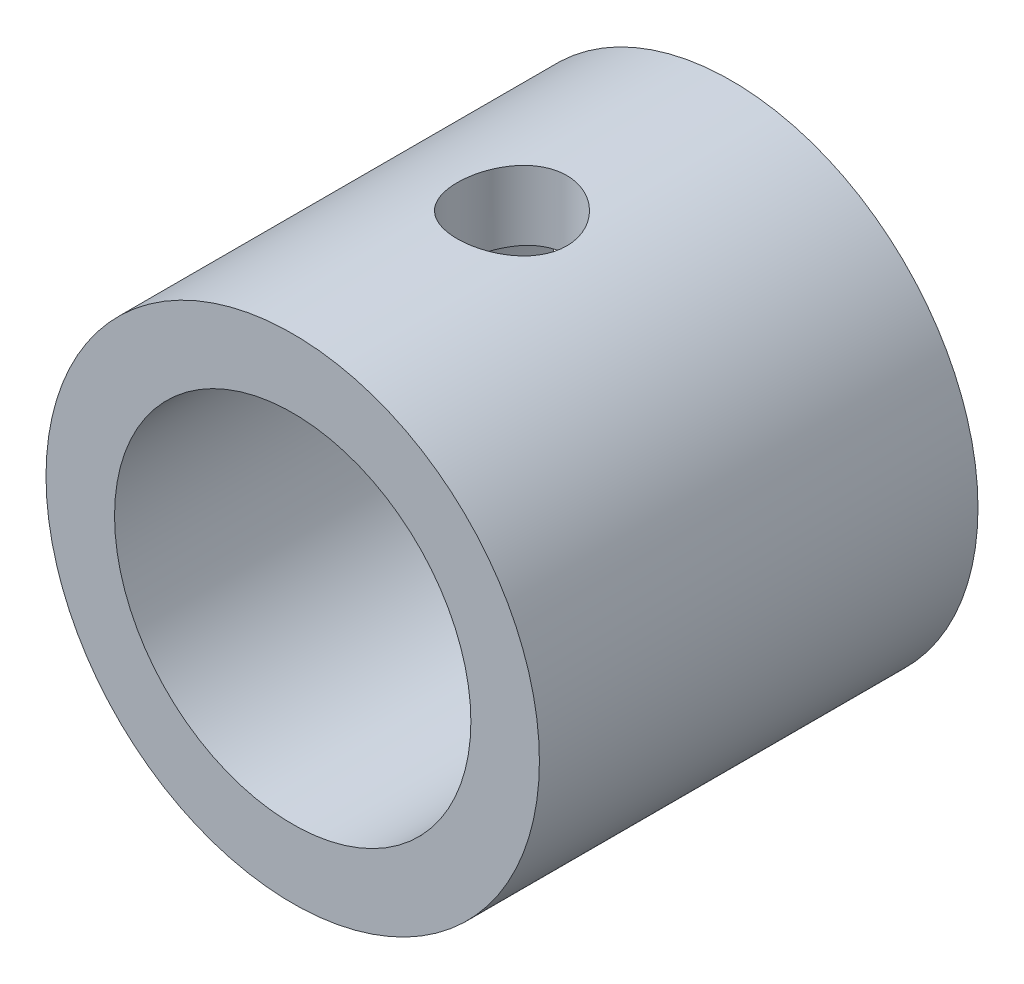
ISO-10303-21;
HEADER;
FILE_DESCRIPTION(('STEP AP214'),'2;1');
FILE_NAME('part.step','',(''),(''),'','','');
FILE_SCHEMA(('AUTOMOTIVE_DESIGN { 1 0 10303 214 1 1 1 1 }'));
ENDSEC;
DATA;
#1=APPLICATION_CONTEXT('core data for automotive mechanical design processes');
#2=APPLICATION_PROTOCOL_DEFINITION('international standard','automotive_design',2000,#1);
#3=PRODUCT_CONTEXT('',#1,'mechanical');
#4=PRODUCT('Part','Part','',(#3));
#5=PRODUCT_RELATED_PRODUCT_CATEGORY('part','',(#4));
#6=PRODUCT_DEFINITION_FORMATION('','',#4);
#7=PRODUCT_DEFINITION_CONTEXT('part definition',#1,'design');
#8=PRODUCT_DEFINITION('design','',#6,#7);
#9=PRODUCT_DEFINITION_SHAPE('','',#8);
#10=(LENGTH_UNIT() NAMED_UNIT(*) SI_UNIT(.MILLI.,.METRE.));
#11=(NAMED_UNIT(*) PLANE_ANGLE_UNIT() SI_UNIT($,.RADIAN.));
#12=(NAMED_UNIT(*) SI_UNIT($,.STERADIAN.) SOLID_ANGLE_UNIT());
#13=UNCERTAINTY_MEASURE_WITH_UNIT(LENGTH_MEASURE(1.E-05),#10,'distance_accuracy_value','');
#14=(GEOMETRIC_REPRESENTATION_CONTEXT(3) GLOBAL_UNCERTAINTY_ASSIGNED_CONTEXT((#13)) GLOBAL_UNIT_ASSIGNED_CONTEXT((#10,
#11,#12)) REPRESENTATION_CONTEXT('',''));
#15=CARTESIAN_POINT('',(0.,0.,0.));
#16=DIRECTION('',(0.,0.,1.));
#17=DIRECTION('',(1.,0.,0.));
#18=AXIS2_PLACEMENT_3D('',#15,#16,#17);
#19=CARTESIAN_POINT('',(0.,0.,8.));
#20=DIRECTION('',(0.,0.,-1.));
#21=DIRECTION('',(-1.,0.,0.));
#22=AXIS2_PLACEMENT_3D('',#19,#20,#21);
#23=CYLINDRICAL_SURFACE('',#22,9.);
#24=CARTESIAN_POINT('',(0.,0.,8.));
#25=DIRECTION('',(0.,0.,1.));
#26=DIRECTION('',(1.,0.,0.));
#27=AXIS2_PLACEMENT_3D('',#24,#25,#26);
#28=CIRCLE('',#27,9.);
#29=CARTESIAN_POINT('',(9.,0.,8.));
#30=VERTEX_POINT('',#29);
#31=EDGE_CURVE('E10',#30,#30,#28,.T.);
#32=ORIENTED_EDGE('',*,*,#31,.F.);
#33=EDGE_LOOP('',(#32));
#34=FACE_BOUND('',#33,.T.);
#35=CARTESIAN_POINT('',(0.,0.,-8.));
#36=DIRECTION('',(0.,0.,1.));
#37=DIRECTION('',(1.,0.,0.));
#38=AXIS2_PLACEMENT_3D('',#35,#36,#37);
#39=CIRCLE('',#38,9.);
#40=CARTESIAN_POINT('',(9.,0.,-8.));
#41=VERTEX_POINT('',#40);
#42=EDGE_CURVE('E38',#41,#41,#39,.T.);
#43=ORIENTED_EDGE('',*,*,#42,.T.);
#44=EDGE_LOOP('',(#43));
#45=FACE_BOUND('',#44,.T.);
#46=CARTESIAN_POINT('',(0.,9.,-2.));
#47=CARTESIAN_POINT('',(0.110880476775648,8.99999796218252,-1.99999627632018));
#48=CARTESIAN_POINT('',(0.22180556526962,8.99793013995692,-1.99074801833651));
#49=CARTESIAN_POINT('',(0.440501944103134,8.9898809775767,-1.95403952764944));
#50=CARTESIAN_POINT('',(0.548270975138988,8.98389690217348,-1.92656656599072));
#51=CARTESIAN_POINT('',(0.757463277761529,8.96868113169008,-1.85431402950835));
#52=CARTESIAN_POINT('',(0.858893152100285,8.95945288439083,-1.80955282300213));
#53=CARTESIAN_POINT('',(1.05280018031376,8.93874335441378,-1.70405338752759));
#54=CARTESIAN_POINT('',(1.14527750793335,8.92726211547358,-1.64331546870938));
#55=CARTESIAN_POINT('',(1.32018631401403,8.9030909417421,-1.50652433489332));
#56=CARTESIAN_POINT('',(1.40244861204353,8.89038561641427,-1.43025749786486));
#57=CARTESIAN_POINT('',(1.55312491045837,8.86530601079787,-1.26503193990686));
#58=CARTESIAN_POINT('',(1.62153764410855,8.85293176088049,-1.17607205928954));
#59=CARTESIAN_POINT('',(1.7433244341035,8.82976328261711,-0.9867281559417));
#60=CARTESIAN_POINT('',(1.79651742104404,8.81898875742981,-0.886225041958469));
#61=CARTESIAN_POINT('',(1.88519298954508,8.80046096352395,-0.677427238307578));
#62=CARTESIAN_POINT('',(1.92067776220096,8.79270732104771,-0.569133514495745));
#63=CARTESIAN_POINT('',(1.97236858006404,8.78125609459189,-0.349666522677334));
#64=CARTESIAN_POINT('',(1.98887467038069,8.77749545807783,-0.238567284894573));
#65=CARTESIAN_POINT('',(2.00307270997673,8.77426673730669,-0.0151177822137992));
#66=CARTESIAN_POINT('',(2.00076704911663,8.77479810778939,0.0972323219621479));
#67=CARTESIAN_POINT('',(1.97764827517302,8.78003632148146,0.317756627193803));
#68=CARTESIAN_POINT('',(1.95718464460217,8.78466431384841,0.425969624139346));
#69=CARTESIAN_POINT('',(1.89888490681146,8.79744954191676,0.637387143325004));
#70=CARTESIAN_POINT('',(1.86104779681652,8.80560698133176,0.740591376085401));
#71=CARTESIAN_POINT('',(1.76875672872875,8.82460909970296,0.940039438381882));
#72=CARTESIAN_POINT('',(1.71416919379353,8.8354752436249,1.03621932733607));
#73=CARTESIAN_POINT('',(1.5900206813985,8.85865737910744,1.21818287051589));
#74=CARTESIAN_POINT('',(1.52045760074274,8.87097357420597,1.30396506182015));
#75=CARTESIAN_POINT('',(1.36648683702983,8.89600574612666,1.46470930934847));
#76=CARTESIAN_POINT('',(1.28178220526623,8.90872450687872,1.53938678510506));
#77=CARTESIAN_POINT('',(1.10090661809162,8.93287839122317,1.67352372890712));
#78=CARTESIAN_POINT('',(1.00473544183737,8.94431349008427,1.7329829037819));
#79=CARTESIAN_POINT('',(0.803303190734734,8.96465064233607,1.83506927577681));
#80=CARTESIAN_POINT('',(0.698022122319853,8.97354693007659,1.87765824430826));
#81=CARTESIAN_POINT('',(0.481555930981455,8.98776136366255,1.94446101305787));
#82=CARTESIAN_POINT('',(0.370371697593365,8.99308004696785,1.96867757341413));
#83=CARTESIAN_POINT('',(0.147695483280844,8.99946317761673,1.99763201325517));
#84=CARTESIAN_POINT('',(0.0362563973189042,9.0006124862229,2.00275850016168));
#85=CARTESIAN_POINT('',(-0.185885923928081,8.99876558650597,1.99444189573963));
#86=CARTESIAN_POINT('',(-0.296589210270647,8.9957696689046,1.98100010668055));
#87=CARTESIAN_POINT('',(-0.512823257329422,8.98602258758613,1.9362505848319));
#88=CARTESIAN_POINT('',(-0.618398491715484,8.97931447007761,1.90514754377655));
#89=CARTESIAN_POINT('',(-0.822832805855832,8.96289421086795,1.82618631255492));
#90=CARTESIAN_POINT('',(-0.921691300010178,8.95318180764659,1.77832666369399));
#91=CARTESIAN_POINT('',(-1.11148643989438,8.9316215322764,1.66640712320101));
#92=CARTESIAN_POINT('',(-1.20228573083225,8.91974444590247,1.60212005699384));
#93=CARTESIAN_POINT('',(-1.37194696498812,8.8952303234908,1.45946875089856));
#94=CARTESIAN_POINT('',(-1.45080730173413,8.88259318550175,1.3811026196679));
#95=CARTESIAN_POINT('',(-1.59589548190985,8.8576887894581,1.2107319664193));
#96=CARTESIAN_POINT('',(-1.66185381940073,8.84543317664284,1.1184959099934));
#97=CARTESIAN_POINT('',(-1.77734611922752,8.82295395378308,0.924027965589185));
#98=CARTESIAN_POINT('',(-1.82688079926974,8.8127302549527,0.821796514657903));
#99=CARTESIAN_POINT('',(-1.90778001896259,8.79557200548926,0.610791710894863));
#100=CARTESIAN_POINT('',(-1.93924786354759,8.78861879659787,0.502059557731161));
#101=CARTESIAN_POINT('',(-1.98342027658406,8.77875649697392,0.280675815137526));
#102=CARTESIAN_POINT('',(-1.99612795718356,8.77584673547331,0.168024878974045));
#103=CARTESIAN_POINT('',(-2.00228356641044,8.77444401448977,-0.055278878278329));
#104=CARTESIAN_POINT('',(-1.99615913143933,8.77585298370124,-0.165919508060061));
#105=CARTESIAN_POINT('',(-1.96578277121688,8.78270664957547,-0.38454970996682));
#106=CARTESIAN_POINT('',(-1.94153107400239,8.78815129547033,-0.492539315423485));
#107=CARTESIAN_POINT('',(-1.87579819980744,8.80241428131525,-0.70244912022738));
#108=CARTESIAN_POINT('',(-1.83438116628454,8.8112200518277,-0.804390316881597));
#109=CARTESIAN_POINT('',(-1.73554770348342,8.83121764469058,-0.999939992546728));
#110=CARTESIAN_POINT('',(-1.67812954585193,8.84240972476633,-1.09354756996401));
#111=CARTESIAN_POINT('',(-1.54751358990558,8.8662104283533,-1.27187660894797));
#112=CARTESIAN_POINT('',(-1.47401185511038,8.8788437136774,-1.35637220492265));
#113=CARTESIAN_POINT('',(-1.31392870594504,8.90393974173387,-1.51197007393133));
#114=CARTESIAN_POINT('',(-1.22734426623343,8.91640244429053,-1.58306924050841));
#115=CARTESIAN_POINT('',(-1.04214597064557,8.93995259726581,-1.71077598291992));
#116=CARTESIAN_POINT('',(-0.943385636634949,8.95101923499229,-1.76717519973493));
#117=CARTESIAN_POINT('',(-0.737560279778818,8.97032058369249,-1.86248330418121));
#118=CARTESIAN_POINT('',(-0.630502203312995,8.97855763270815,-1.90140664004617));
#119=CARTESIAN_POINT('',(-0.436138247729409,8.98982812909554,-1.95384135027679));
#120=CARTESIAN_POINT('',(-0.349871991901682,8.9936186902321,-1.97111737366629));
#121=CARTESIAN_POINT('',(-0.175746449894528,8.99870537459789,-1.99419790430615));
#122=CARTESIAN_POINT('',(-0.0878872388928781,9.00000161523613,-2.0000029515019));
#123=CARTESIAN_POINT('',(0.,9.,-2.));
#124=B_SPLINE_CURVE_WITH_KNOTS('',3,(#46,#47,#48,#49,#50,#51,#52,#53,#54,#55,#56,#57,#58,#59,
#60,#61,#62,#63,#64,#65,#66,#67,#68,#69,#70,#71,#72,#73,#74,#75,#76,#77,#78,#79,#80,#81,#82,#83,
#84,#85,#86,#87,#88,#89,#90,#91,#92,#93,#94,#95,#96,#97,#98,#99,#100,#101,#102,#103,#104,#105,
#106,#107,#108,#109,#110,#111,#112,#113,#114,#115,#116,#117,#118,#119,#120,#121,#122,#123),
.UNSPECIFIED.,.T.,.F.,(4,2,2,2,2,2,2,2,2,2,2,2,2,2,2,2,2,2,2,2,2,2,2,2,2,2,2,2,2,2,2,2,2,2,2,2,
2,2,4),(0.,0.332319689729797,0.664871731249283,0.997071412407459,1.32926464516989,
1.66638072002079,2.00352761490514,2.34453296297976,2.6854961068774,3.02099125638107,
3.35644378496591,3.68557668145784,4.0147285774694,4.34657669709581,4.678471452583,
5.01778179808977,5.35709867969828,5.69718012811238,6.03721047501988,6.37027992124269,
6.70332600912267,7.03258869425167,7.36188004945459,7.69599803262041,8.03016093387756,
8.37069473105728,8.71121364510411,9.04976559055243,9.38826136686411,9.71912785142416,
10.0499901738286,10.3796271201578,10.7092996858639,11.0458432631282,11.3824647846641,
11.7236258704957,12.0645043787094,12.3279234735856,12.5913301688795),.UNSPECIFIED.);
#125=CARTESIAN_POINT('',(0.,9.,-2.));
#126=VERTEX_POINT('',#125);
#127=EDGE_CURVE('E53',#126,#126,#124,.T.);
#128=ORIENTED_EDGE('',*,*,#127,.T.);
#129=EDGE_LOOP('',(#128));
#130=FACE_BOUND('',#129,.T.);
#131=ADVANCED_FACE('F35',(#34,#45,#130),#23,.T.);
#132=CARTESIAN_POINT('',(0.,0.,8.));
#133=DIRECTION('',(0.,0.,-1.));
#134=DIRECTION('',(-1.,0.,0.));
#135=AXIS2_PLACEMENT_3D('',#132,#133,#134);
#136=CYLINDRICAL_SURFACE('',#135,6.5);
#137=CARTESIAN_POINT('',(0.,0.,-8.));
#138=DIRECTION('',(0.,0.,1.));
#139=DIRECTION('',(1.,0.,0.));
#140=AXIS2_PLACEMENT_3D('',#137,#138,#139);
#141=CIRCLE('',#140,6.5);
#142=CARTESIAN_POINT('',(6.5,0.,-8.));
#143=VERTEX_POINT('',#142);
#144=EDGE_CURVE('E47',#143,#143,#141,.T.);
#145=ORIENTED_EDGE('',*,*,#144,.F.);
#146=EDGE_LOOP('',(#145));
#147=FACE_BOUND('',#146,.T.);
#148=CARTESIAN_POINT('',(0.,0.,8.));
#149=DIRECTION('',(0.,0.,1.));
#150=DIRECTION('',(1.,0.,0.));
#151=AXIS2_PLACEMENT_3D('',#148,#149,#150);
#152=CIRCLE('',#151,6.5);
#153=CARTESIAN_POINT('',(6.5,0.,8.));
#154=VERTEX_POINT('',#153);
#155=EDGE_CURVE('E45',#154,#154,#152,.T.);
#156=ORIENTED_EDGE('',*,*,#155,.T.);
#157=EDGE_LOOP('',(#156));
#158=FACE_BOUND('',#157,.T.);
#159=CARTESIAN_POINT('',(0.,6.5,-2.));
#160=CARTESIAN_POINT('',(0.10958647155408,6.49999929187436,-1.99999903907904));
#161=CARTESIAN_POINT('',(0.219182761349475,6.49720235792931,-1.99096335239673));
#162=CARTESIAN_POINT('',(0.435175528984373,6.48631855265072,-1.95515058806477));
#163=CARTESIAN_POINT('',(0.541571186300281,6.47823033671536,-1.92836900086749));
#164=CARTESIAN_POINT('',(0.748016546984701,6.45764858487676,-1.85804929310721));
#165=CARTESIAN_POINT('',(0.848075627090343,6.44516174661238,-1.81453663922322));
#166=CARTESIAN_POINT('',(1.03947745536717,6.41707535917941,-1.71209679263276));
#167=CARTESIAN_POINT('',(1.13081890919355,6.40147534884382,-1.65316731576617));
#168=CARTESIAN_POINT('',(1.30493699247679,6.36829752406617,-1.51970232456005));
#169=CARTESIAN_POINT('',(1.38741488565838,6.35067760587489,-1.44478758075688));
#170=CARTESIAN_POINT('',(1.53885708269872,6.31569252815343,-1.28228637649204));
#171=CARTESIAN_POINT('',(1.60781896662595,6.29832741475793,-1.19469765172807));
#172=CARTESIAN_POINT('',(1.73187276184925,6.2653687784566,-1.00677139557264));
#173=CARTESIAN_POINT('',(1.78659481361997,6.24982736044083,-0.906179710702226));
#174=CARTESIAN_POINT('',(1.8782224418158,6.22290748386974,-0.696666036262746));
#175=CARTESIAN_POINT('',(1.91513254914664,6.21152796681115,-0.58774617334561));
#176=CARTESIAN_POINT('',(1.96900160513188,6.19466009001292,-0.36803269394755));
#177=CARTESIAN_POINT('',(1.9865133955599,6.18900890037713,-0.257387466392708));
#178=CARTESIAN_POINT('',(2.00281555895419,6.1837537050085,-0.0345962594275914));
#179=CARTESIAN_POINT('',(2.00161073572821,6.18414814760279,0.077549327517495));
#180=CARTESIAN_POINT('',(1.98094698228321,6.19079569362891,0.2956150705989));
#181=CARTESIAN_POINT('',(1.96218684702854,6.19682450731138,0.401609425322224));
#182=CARTESIAN_POINT('',(1.90807645250928,6.21369772255051,0.608866696596906));
#183=CARTESIAN_POINT('',(1.87272447914839,6.22454262164885,0.710129123105842));
#184=CARTESIAN_POINT('',(1.785932217008,6.25000070721951,0.906730047845012));
#185=CARTESIAN_POINT('',(1.73426970827151,6.2646654217354,1.00196348562844));
#186=CARTESIAN_POINT('',(1.61647725848254,6.29608673576222,1.18264054437169));
#187=CARTESIAN_POINT('',(1.55034365635742,6.31284386417593,1.26808167960593));
#188=CARTESIAN_POINT('',(1.40204114131455,6.34746551983527,1.43070438833206));
#189=CARTESIAN_POINT('',(1.31929416295853,6.36534631113152,1.50735628256663));
#190=CARTESIAN_POINT('',(1.14189770882472,6.39954830533242,1.64582220434313));
#191=CARTESIAN_POINT('',(1.04724740490765,6.4158693995865,1.7076351986405));
#192=CARTESIAN_POINT('',(0.847732923697558,6.44527556867774,1.8150129771275));
#193=CARTESIAN_POINT('',(0.742798718966909,6.45833594999018,1.86045486403883));
#194=CARTESIAN_POINT('',(0.526280934909782,6.47957102319473,1.93288625395853));
#195=CARTESIAN_POINT('',(0.414699321015766,6.48774715140185,1.95988118201066));
#196=CARTESIAN_POINT('',(0.192552832432243,6.49806290071844,1.99375804657509));
#197=CARTESIAN_POINT('',(0.0821071867281238,6.50041772114305,2.0013573525657));
#198=CARTESIAN_POINT('',(-0.138491178007733,6.49946000316609,1.99824523351199));
#199=CARTESIAN_POINT('',(-0.248643936188298,6.49614826472318,1.98753639306293));
#200=CARTESIAN_POINT('',(-0.46278580145148,6.48437074848215,1.94868951788977));
#201=CARTESIAN_POINT('',(-0.566859358780056,6.47603039774079,1.92097535283384));
#202=CARTESIAN_POINT('',(-0.768852811369361,6.45516726536364,1.8494189235729));
#203=CARTESIAN_POINT('',(-0.866771952253669,6.44264397218779,1.80557468672391));
#204=CARTESIAN_POINT('',(-1.05627961444668,6.41433382910965,1.70182880519005));
#205=CARTESIAN_POINT('',(-1.14766081519562,6.39847611273322,1.64156832323482));
#206=CARTESIAN_POINT('',(-1.31925606832413,6.36531333623025,1.50713316991917));
#207=CARTESIAN_POINT('',(-1.39946717074091,6.34800789569184,1.43295483502397));
#208=CARTESIAN_POINT('',(-1.54963528009096,6.31306645909658,1.26941670055103));
#209=CARTESIAN_POINT('',(-1.61908131008095,6.29544322340724,1.17958392405072));
#210=CARTESIAN_POINT('',(-1.74195487773042,6.26255963317191,0.989156665398131));
#211=CARTESIAN_POINT('',(-1.79538273895787,6.24729923089955,0.888562400684256));
#212=CARTESIAN_POINT('',(-1.88435707765313,6.22104126828921,0.679721743070963));
#213=CARTESIAN_POINT('',(-1.9199786710239,6.21002584634022,0.571509730226962));
#214=CARTESIAN_POINT('',(-1.97237526121825,6.19358575896332,0.350217384273935));
#215=CARTESIAN_POINT('',(-1.98915714872108,6.18815904950702,0.237138846833982));
#216=CARTESIAN_POINT('',(-2.00291323790433,6.18371932373484,0.0146519278920736));
#217=CARTESIAN_POINT('',(-2.00072360720728,6.18443554393433,-0.094700004551062));
#218=CARTESIAN_POINT('',(-1.97860856561739,6.19154584982148,-0.311397838847259));
#219=CARTESIAN_POINT('',(-1.95868393542585,6.19793968557834,-0.418743828790289));
#220=CARTESIAN_POINT('',(-1.90221657867545,6.21549850608435,-0.626937428537499));
#221=CARTESIAN_POINT('',(-1.8659061649831,6.22659666514378,-0.727854105684839));
#222=CARTESIAN_POINT('',(-1.77788001247773,6.25229841004041,-0.92224355662551));
#223=CARTESIAN_POINT('',(-1.72616121006624,6.26690269287625,-1.01571484538877));
#224=CARTESIAN_POINT('',(-1.60648172875982,6.29866516433667,-1.19641250748051));
#225=CARTESIAN_POINT('',(-1.5379775201733,6.31589943241281,-1.28326549413256));
#226=CARTESIAN_POINT('',(-1.38763671757875,6.35062263668655,-1.44451406697947));
#227=CARTESIAN_POINT('',(-1.30579660000223,6.36811163907406,-1.51890635028652));
#228=CARTESIAN_POINT('',(-1.12802317077525,6.40203042414332,-1.65544917959683));
#229=CARTESIAN_POINT('',(-1.0317288656853,6.41840990638034,-1.71714357533484));
#230=CARTESIAN_POINT('',(-0.829631192009797,6.44764383058531,-1.82338445665249));
#231=CARTESIAN_POINT('',(-0.7238318640324,6.46049976109691,-1.86793818662102));
#232=CARTESIAN_POINT('',(-0.515929652571417,6.48025348346413,-1.93510071206019));
#233=CARTESIAN_POINT('',(-0.414403258515525,6.48759534805451,-1.95936947108914));
#234=CARTESIAN_POINT('',(-0.208587191828517,6.4974684909107,-1.99181805932323));
#235=CARTESIAN_POINT('',(-0.104298042658334,6.50000067395288,-2.00000091454879));
#236=CARTESIAN_POINT('',(0.,6.5,-2.));
#237=B_SPLINE_CURVE_WITH_KNOTS('',3,(#159,#160,#161,#162,#163,#164,#165,#166,#167,#168,#169,
#170,#171,#172,#173,#174,#175,#176,#177,#178,#179,#180,#181,#182,#183,#184,#185,#186,#187,#188,
#189,#190,#191,#192,#193,#194,#195,#196,#197,#198,#199,#200,#201,#202,#203,#204,#205,#206,#207,
#208,#209,#210,#211,#212,#213,#214,#215,#216,#217,#218,#219,#220,#221,#222,#223,#224,#225,#226,
#227,#228,#229,#230,#231,#232,#233,#234,#235,#236),.UNSPECIFIED.,.T.,.F.,(4,2,2,2,2,2,2,2,2,2,2,
2,2,2,2,2,2,2,2,2,2,2,2,2,2,2,2,2,2,2,2,2,2,2,2,2,2,2,4),(0.,0.328376148353204,
0.656835774920463,0.984797413319644,1.31280767013794,1.64969601962051,1.98664463123191,
2.33162619975385,2.67651996741947,3.0113091274622,3.34601236190892,3.66793485951994,
3.98989062214147,4.31643724588171,4.64306657905952,4.98408507994297,5.32512731933627,
5.66867887562647,6.01212935372403,6.34267966649236,6.67318331870836,6.99576592200042,
7.31838798898982,7.6487232534981,7.97914559299321,8.322234878021,8.66531723215741,
9.00693981167225,9.34843740094787,9.67496275718919,10.0014737403731,10.3234943027839,
10.6455789342452,10.9799294848454,11.3143685200785,11.6592775258489,12.0040405975475,
12.3166287634493,12.6291581207982),.UNSPECIFIED.);
#238=CARTESIAN_POINT('',(0.,6.5,-2.));
#239=VERTEX_POINT('',#238);
#240=EDGE_CURVE('E50',#239,#239,#237,.T.);
#241=ORIENTED_EDGE('',*,*,#240,.F.);
#242=EDGE_LOOP('',(#241));
#243=FACE_BOUND('',#242,.T.);
#244=ADVANCED_FACE('F73',(#147,#158,#243),#136,.F.);
#245=CARTESIAN_POINT('',(0.,0.,8.));
#246=DIRECTION('',(0.,0.,1.));
#247=DIRECTION('',(1.,0.,0.));
#248=AXIS2_PLACEMENT_3D('',#245,#246,#247);
#249=PLANE('',#248);
#250=ORIENTED_EDGE('',*,*,#31,.T.);
#251=EDGE_LOOP('',(#250));
#252=FACE_BOUND('',#251,.T.);
#253=ORIENTED_EDGE('',*,*,#155,.F.);
#254=EDGE_LOOP('',(#253));
#255=FACE_BOUND('',#254,.T.);
#256=ADVANCED_FACE('F77',(#252,#255),#249,.T.);
#257=CARTESIAN_POINT('',(0.,0.,-8.));
#258=DIRECTION('',(0.,0.,1.));
#259=DIRECTION('',(1.,0.,0.));
#260=AXIS2_PLACEMENT_3D('',#257,#258,#259);
#261=PLANE('',#260);
#262=ORIENTED_EDGE('',*,*,#42,.F.);
#263=EDGE_LOOP('',(#262));
#264=FACE_BOUND('',#263,.T.);
#265=ORIENTED_EDGE('',*,*,#144,.T.);
#266=EDGE_LOOP('',(#265));
#267=FACE_BOUND('',#266,.T.);
#268=ADVANCED_FACE('F71',(#264,#267),#261,.F.);
#269=CARTESIAN_POINT('',(0.,9.001,0.));
#270=DIRECTION('',(0.,-1.,0.));
#271=DIRECTION('',(0.,0.,-1.));
#272=AXIS2_PLACEMENT_3D('',#269,#270,#271);
#273=CYLINDRICAL_SURFACE('',#272,2.);
#274=ORIENTED_EDGE('',*,*,#240,.T.);
#275=EDGE_LOOP('',(#274));
#276=FACE_BOUND('',#275,.T.);
#277=ORIENTED_EDGE('',*,*,#127,.F.);
#278=EDGE_LOOP('',(#277));
#279=FACE_BOUND('',#278,.T.);
#280=ADVANCED_FACE('F65',(#276,#279),#273,.F.);
#281=CLOSED_SHELL('',(#131,#244,#256,#268,#280));
#282=MANIFOLD_SOLID_BREP('B2',#281);
#283=ADVANCED_BREP_SHAPE_REPRESENTATION('',(#18,#282),#14);
#284=SHAPE_DEFINITION_REPRESENTATION(#9,#283);
ENDSEC;
END-ISO-10303-21;
